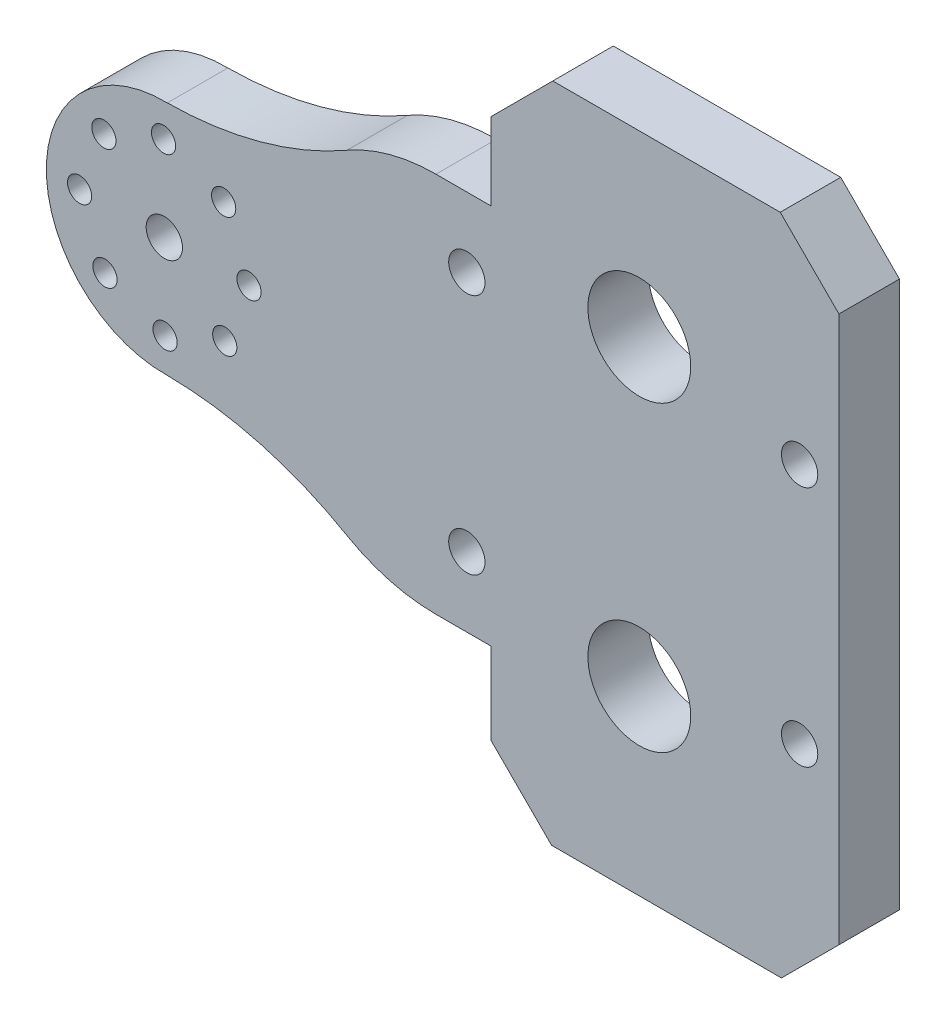
ISO-10303-21;
HEADER;
FILE_DESCRIPTION(('STEP AP214'),'2;1');
FILE_NAME('part.step','',(''),(''),'','','');
FILE_SCHEMA(('AUTOMOTIVE_DESIGN { 1 0 10303 214 1 1 1 1 }'));
ENDSEC;
DATA;
#1=APPLICATION_CONTEXT('core data for automotive mechanical design processes');
#2=APPLICATION_PROTOCOL_DEFINITION('international standard','automotive_design',2000,#1);
#3=PRODUCT_CONTEXT('',#1,'mechanical');
#4=PRODUCT('Part','Part','',(#3));
#5=PRODUCT_RELATED_PRODUCT_CATEGORY('part','',(#4));
#6=PRODUCT_DEFINITION_FORMATION('','',#4);
#7=PRODUCT_DEFINITION_CONTEXT('part definition',#1,'design');
#8=PRODUCT_DEFINITION('design','',#6,#7);
#9=PRODUCT_DEFINITION_SHAPE('','',#8);
#10=(LENGTH_UNIT() NAMED_UNIT(*) SI_UNIT(.MILLI.,.METRE.));
#11=(NAMED_UNIT(*) PLANE_ANGLE_UNIT() SI_UNIT($,.RADIAN.));
#12=(NAMED_UNIT(*) SI_UNIT($,.STERADIAN.) SOLID_ANGLE_UNIT());
#13=UNCERTAINTY_MEASURE_WITH_UNIT(LENGTH_MEASURE(1.E-05),#10,'distance_accuracy_value','');
#14=(GEOMETRIC_REPRESENTATION_CONTEXT(3) GLOBAL_UNCERTAINTY_ASSIGNED_CONTEXT((#13)) GLOBAL_UNIT_ASSIGNED_CONTEXT((#10,
#11,#12)) REPRESENTATION_CONTEXT('',''));
#15=CARTESIAN_POINT('',(0.,0.,0.));
#16=DIRECTION('',(0.,0.,1.));
#17=DIRECTION('',(1.,0.,0.));
#18=AXIS2_PLACEMENT_3D('',#15,#16,#17);
#19=CARTESIAN_POINT('',(16.700860260171,3.2922916539892,5.));
#20=DIRECTION('',(0.,0.,1.));
#21=DIRECTION('',(1.,0.,0.));
#22=AXIS2_PLACEMENT_3D('',#19,#20,#21);
#23=PLANE('',#22);
#24=CARTESIAN_POINT('',(-5.8115386358992,9.29229165398919,5.));
#25=DIRECTION('',(0.,0.,1.));
#26=DIRECTION('',(1.,0.,0.));
#27=AXIS2_PLACEMENT_3D('',#24,#25,#26);
#28=CIRCLE('',#27,1.);
#29=CARTESIAN_POINT('',(-4.8115386358992,9.29229165398919,5.));
#30=VERTEX_POINT('',#29);
#31=EDGE_CURVE('E417',#30,#30,#28,.T.);
#32=ORIENTED_EDGE('',*,*,#31,.F.);
#33=EDGE_LOOP('',(#32));
#34=FACE_BOUND('',#33,.T.);
#35=CARTESIAN_POINT('',(-12.7490840604726,2.22983707856261,5.));
#36=DIRECTION('',(0.,0.,1.));
#37=DIRECTION('',(1.,0.,0.));
#38=AXIS2_PLACEMENT_3D('',#35,#36,#37);
#39=CIRCLE('',#38,0.999999999999998);
#40=CARTESIAN_POINT('',(-11.7490840604726,2.22983707856261,5.));
#41=VERTEX_POINT('',#40);
#42=EDGE_CURVE('E429',#41,#41,#39,.T.);
#43=ORIENTED_EDGE('',*,*,#42,.F.);
#44=EDGE_LOOP('',(#43));
#45=FACE_BOUND('',#44,.T.);
#46=CARTESIAN_POINT('',(-5.68662948504604,-4.70770834601081,5.));
#47=DIRECTION('',(0.,0.,1.));
#48=DIRECTION('',(1.,0.,0.));
#49=AXIS2_PLACEMENT_3D('',#46,#47,#48);
#50=CIRCLE('',#49,1.);
#51=CARTESIAN_POINT('',(-4.68662948504604,-4.70770834601081,5.));
#52=VERTEX_POINT('',#51);
#53=EDGE_CURVE('E441',#52,#52,#50,.T.);
#54=ORIENTED_EDGE('',*,*,#53,.F.);
#55=EDGE_LOOP('',(#54));
#56=FACE_BOUND('',#55,.T.);
#57=CARTESIAN_POINT('',(1.25091593952738,2.35474622941577,5.));
#58=DIRECTION('',(0.,0.,1.));
#59=DIRECTION('',(1.,0.,0.));
#60=AXIS2_PLACEMENT_3D('',#57,#58,#59);
#61=CIRCLE('',#60,1.);
#62=CARTESIAN_POINT('',(2.25091593952738,2.35474622941577,5.));
#63=VERTEX_POINT('',#62);
#64=EDGE_CURVE('E453',#63,#63,#61,.T.);
#65=ORIENTED_EDGE('',*,*,#64,.F.);
#66=EDGE_LOOP('',(#65));
#67=FACE_BOUND('',#66,.T.);
#68=CARTESIAN_POINT('',(19.2509159395274,-7.70770834601081,5.));
#69=DIRECTION('',(0.,0.,1.));
#70=DIRECTION('',(1.,0.,0.));
#71=AXIS2_PLACEMENT_3D('',#68,#69,#70);
#72=CIRCLE('',#71,1.5);
#73=CARTESIAN_POINT('',(20.7509159395274,-7.70770834601081,5.));
#74=VERTEX_POINT('',#73);
#75=EDGE_CURVE('E465',#74,#74,#72,.T.);
#76=ORIENTED_EDGE('',*,*,#75,.F.);
#77=EDGE_LOOP('',(#76));
#78=FACE_BOUND('',#77,.T.);
#79=CARTESIAN_POINT('',(33.5009159395274,-10.2077083460108,5.));
#80=DIRECTION('',(0.,0.,1.));
#81=DIRECTION('',(1.,0.,0.));
#82=AXIS2_PLACEMENT_3D('',#79,#80,#81);
#83=CIRCLE('',#82,4.25000000000001);
#84=CARTESIAN_POINT('',(37.7509159395274,-10.2077083460108,5.));
#85=VERTEX_POINT('',#84);
#86=EDGE_CURVE('E477',#85,#85,#83,.T.);
#87=ORIENTED_EDGE('',*,*,#86,.F.);
#88=EDGE_LOOP('',(#87));
#89=FACE_BOUND('',#88,.T.);
#90=CARTESIAN_POINT('',(46.7509159395274,12.2922916539892,5.));
#91=DIRECTION('',(0.,0.,1.));
#92=DIRECTION('',(1.,0.,0.));
#93=AXIS2_PLACEMENT_3D('',#90,#91,#92);
#94=CIRCLE('',#93,1.5);
#95=CARTESIAN_POINT('',(48.2509159395274,12.2922916539892,5.));
#96=VERTEX_POINT('',#95);
#97=EDGE_CURVE('E489',#96,#96,#94,.T.);
#98=ORIENTED_EDGE('',*,*,#97,.F.);
#99=EDGE_LOOP('',(#98));
#100=FACE_BOUND('',#99,.T.);
#101=DIRECTION('',(1.,0.,0.));
#102=VECTOR('',#101,1.);
#103=CARTESIAN_POINT('',(26.2509159395273,-25.2077083460108,5.));
#104=LINE('',#103,#102);
#105=CARTESIAN_POINT('',(26.2509159395273,-25.2077083460108,5.));
#106=VERTEX_POINT('',#105);
#107=CARTESIAN_POINT('',(45.2509159395274,-25.2077083460108,5.));
#108=VERTEX_POINT('',#107);
#109=EDGE_CURVE('E228',#106,#108,#104,.T.);
#110=ORIENTED_EDGE('',*,*,#109,.T.);
#111=DIRECTION('',(0.707106781186549,0.707106781186546,0.));
#112=VECTOR('',#111,1.);
#113=CARTESIAN_POINT('',(45.2509159395274,-25.2077083460108,5.));
#114=LINE('',#113,#112);
#115=CARTESIAN_POINT('',(50.0009159395274,-20.4577083460108,5.));
#116=VERTEX_POINT('',#115);
#117=EDGE_CURVE('E125',#108,#116,#114,.T.);
#118=ORIENTED_EDGE('',*,*,#117,.T.);
#119=DIRECTION('',(0.,1.,0.));
#120=VECTOR('',#119,1.);
#121=CARTESIAN_POINT('',(50.0009159395274,-20.4577083460108,5.));
#122=LINE('',#121,#120);
#123=CARTESIAN_POINT('',(50.0009159395274,24.6887382633959,5.));
#124=VERTEX_POINT('',#123);
#125=EDGE_CURVE('E273',#116,#124,#122,.T.);
#126=ORIENTED_EDGE('',*,*,#125,.T.);
#127=DIRECTION('',(-0.707106781186548,0.707106781186547,0.));
#128=VECTOR('',#127,1.);
#129=CARTESIAN_POINT('',(50.0009159395274,24.6887382633959,5.));
#130=LINE('',#129,#128);
#131=CARTESIAN_POINT('',(45.1473625489341,29.5422916539892,5.));
#132=VERTEX_POINT('',#131);
#133=EDGE_CURVE('E292',#124,#132,#130,.T.);
#134=ORIENTED_EDGE('',*,*,#133,.T.);
#135=DIRECTION('',(-1.,0.,0.));
#136=VECTOR('',#135,1.);
#137=CARTESIAN_POINT('',(45.1473625489341,29.5422916539892,5.));
#138=LINE('',#137,#136);
#139=CARTESIAN_POINT('',(26.3544693301207,29.5422916539892,5.));
#140=VERTEX_POINT('',#139);
#141=EDGE_CURVE('E289',#132,#140,#138,.T.);
#142=ORIENTED_EDGE('',*,*,#141,.T.);
#143=DIRECTION('',(-0.707106781186548,-0.707106781186547,0.));
#144=VECTOR('',#143,1.);
#145=CARTESIAN_POINT('',(26.3544693301207,29.5422916539892,5.));
#146=LINE('',#145,#144);
#147=CARTESIAN_POINT('',(21.2509159395274,24.4387382633959,5.));
#148=VERTEX_POINT('',#147);
#149=EDGE_CURVE('E291',#140,#148,#146,.T.);
#150=ORIENTED_EDGE('',*,*,#149,.T.);
#151=DIRECTION('',(0.,-1.,0.));
#152=VECTOR('',#151,1.);
#153=CARTESIAN_POINT('',(21.2509159395274,24.4387382633959,5.));
#154=LINE('',#153,#152);
#155=CARTESIAN_POINT('',(21.2509159395274,18.0422916539892,5.));
#156=VERTEX_POINT('',#155);
#157=EDGE_CURVE('E294',#148,#156,#154,.T.);
#158=ORIENTED_EDGE('',*,*,#157,.T.);
#159=DIRECTION('',(-1.,0.,0.));
#160=VECTOR('',#159,1.);
#161=CARTESIAN_POINT('',(21.2509159395274,18.0422916539892,5.));
#162=LINE('',#161,#160);
#163=CARTESIAN_POINT('',(16.700860260171,18.0422916539892,5.));
#164=VERTEX_POINT('',#163);
#165=EDGE_CURVE('E300',#156,#164,#162,.T.);
#166=ORIENTED_EDGE('',*,*,#165,.T.);
#167=CARTESIAN_POINT('',(16.700860260171,3.2922916539892,5.));
#168=DIRECTION('',(0.,0.,1.));
#169=DIRECTION('',(1.,0.,0.));
#170=AXIS2_PLACEMENT_3D('',#167,#168,#169);
#171=CIRCLE('',#170,14.75);
#172=CARTESIAN_POINT('',(9.34226739951562,16.0756249873225,5.));
#173=VERTEX_POINT('',#172);
#174=EDGE_CURVE('E302',#164,#173,#171,.T.);
#175=ORIENTED_EDGE('',*,*,#174,.T.);
#176=CARTESIAN_POINT('',(-5.74908406047262,42.2922916539892,5.));
#177=DIRECTION('',(0.,0.,-1.));
#178=DIRECTION('',(1.,0.,0.));
#179=AXIS2_PLACEMENT_3D('',#176,#177,#178);
#180=CIRCLE('',#179,30.25);
#181=CARTESIAN_POINT('',(-5.49908406047263,12.0433247294808,5.));
#182=VERTEX_POINT('',#181);
#183=EDGE_CURVE('E304',#173,#182,#180,.T.);
#184=ORIENTED_EDGE('',*,*,#183,.T.);
#185=DIRECTION('',(3.06941559721248E-12,-1.,0.));
#186=VECTOR('',#185,1.);
#187=CARTESIAN_POINT('',(-5.49908406047263,12.0433247294808,5.));
#188=LINE('',#187,#186);
#189=CARTESIAN_POINT('',(-5.49908406047262,12.0390859987982,5.));
#190=VERTEX_POINT('',#189);
#191=EDGE_CURVE('E306',#182,#190,#188,.T.);
#192=ORIENTED_EDGE('',*,*,#191,.T.);
#193=CARTESIAN_POINT('',(-5.74908406047262,2.29229165398919,5.));
#194=DIRECTION('',(0.,0.,1.));
#195=DIRECTION('',(1.,0.,0.));
#196=AXIS2_PLACEMENT_3D('',#193,#194,#195);
#197=CIRCLE('',#196,9.75);
#198=CARTESIAN_POINT('',(-5.49908406047262,-7.45450269081977,5.));
#199=VERTEX_POINT('',#198);
#200=EDGE_CURVE('E308',#190,#199,#197,.T.);
#201=ORIENTED_EDGE('',*,*,#200,.T.);
#202=DIRECTION('',(4.09255412961497E-13,-1.,0.));
#203=VECTOR('',#202,1.);
#204=CARTESIAN_POINT('',(-5.49908406047262,-7.45450269081977,5.));
#205=LINE('',#204,#203);
#206=CARTESIAN_POINT('',(-5.49908406047262,-7.45874142150246,5.));
#207=VERTEX_POINT('',#206);
#208=EDGE_CURVE('E310',#199,#207,#205,.T.);
#209=ORIENTED_EDGE('',*,*,#208,.T.);
#210=CARTESIAN_POINT('',(-5.74908406047262,-37.7077083460108,5.));
#211=DIRECTION('',(0.,0.,-1.));
#212=DIRECTION('',(1.,0.,0.));
#213=AXIS2_PLACEMENT_3D('',#210,#211,#212);
#214=CIRCLE('',#213,30.25);
#215=CARTESIAN_POINT('',(9.3422673995156,-11.4910416793441,5.));
#216=VERTEX_POINT('',#215);
#217=EDGE_CURVE('E312',#207,#216,#214,.T.);
#218=ORIENTED_EDGE('',*,*,#217,.T.);
#219=CARTESIAN_POINT('',(16.700860260171,1.2922916539892,5.));
#220=DIRECTION('',(0.,0.,1.));
#221=DIRECTION('',(1.,0.,0.));
#222=AXIS2_PLACEMENT_3D('',#219,#220,#221);
#223=CIRCLE('',#222,14.75);
#224=CARTESIAN_POINT('',(16.700860260171,-13.4577083460108,5.));
#225=VERTEX_POINT('',#224);
#226=EDGE_CURVE('E174',#216,#225,#223,.T.);
#227=ORIENTED_EDGE('',*,*,#226,.T.);
#228=DIRECTION('',(1.,0.,0.));
#229=VECTOR('',#228,1.);
#230=CARTESIAN_POINT('',(16.700860260171,-13.4577083460108,5.));
#231=LINE('',#230,#229);
#232=CARTESIAN_POINT('',(21.2509159395274,-13.4577083460108,5.));
#233=VERTEX_POINT('',#232);
#234=EDGE_CURVE('E168',#225,#233,#231,.T.);
#235=ORIENTED_EDGE('',*,*,#234,.T.);
#236=DIRECTION('',(0.,-1.,0.));
#237=VECTOR('',#236,1.);
#238=CARTESIAN_POINT('',(21.2509159395274,-13.4577083460108,5.));
#239=LINE('',#238,#237);
#240=CARTESIAN_POINT('',(21.2509159395274,-20.2077083460108,5.));
#241=VERTEX_POINT('',#240);
#242=EDGE_CURVE('E172',#233,#241,#239,.T.);
#243=ORIENTED_EDGE('',*,*,#242,.T.);
#244=DIRECTION('',(0.707106781186544,-0.707106781186551,0.));
#245=VECTOR('',#244,1.);
#246=CARTESIAN_POINT('',(21.2509159395274,-20.2077083460108,5.));
#247=LINE('',#246,#245);
#248=EDGE_CURVE('E52',#241,#106,#247,.T.);
#249=ORIENTED_EDGE('',*,*,#248,.T.);
#250=EDGE_LOOP('',(#110,#118,#126,#134,#142,#150,#158,#166,#175,#184,#192,#201,#209,#218,#227,
#235,#243,#249));
#251=FACE_BOUND('',#250,.T.);
#252=CARTESIAN_POINT('',(46.7509159395274,-7.70770834601081,5.));
#253=DIRECTION('',(0.,0.,1.));
#254=DIRECTION('',(1.,0.,0.));
#255=AXIS2_PLACEMENT_3D('',#252,#253,#254);
#256=CIRCLE('',#255,1.5);
#257=CARTESIAN_POINT('',(48.2509159395274,-7.70770834601081,5.));
#258=VERTEX_POINT('',#257);
#259=EDGE_CURVE('E195',#258,#258,#256,.T.);
#260=ORIENTED_EDGE('',*,*,#259,.F.);
#261=EDGE_LOOP('',(#260));
#262=FACE_BOUND('',#261,.T.);
#263=CARTESIAN_POINT('',(33.5009159395274,14.7922916539892,5.));
#264=DIRECTION('',(0.,0.,1.));
#265=DIRECTION('',(1.,0.,0.));
#266=AXIS2_PLACEMENT_3D('',#263,#264,#265);
#267=CIRCLE('',#266,4.25);
#268=CARTESIAN_POINT('',(37.7509159395274,14.7922916539892,5.));
#269=VERTEX_POINT('',#268);
#270=EDGE_CURVE('E483',#269,#269,#267,.T.);
#271=ORIENTED_EDGE('',*,*,#270,.F.);
#272=EDGE_LOOP('',(#271));
#273=FACE_BOUND('',#272,.T.);
#274=CARTESIAN_POINT('',(19.2509159395274,12.2922916539892,5.));
#275=DIRECTION('',(0.,0.,1.));
#276=DIRECTION('',(1.,0.,0.));
#277=AXIS2_PLACEMENT_3D('',#274,#275,#276);
#278=CIRCLE('',#277,1.5);
#279=CARTESIAN_POINT('',(20.7509159395274,12.2922916539892,5.));
#280=VERTEX_POINT('',#279);
#281=EDGE_CURVE('E471',#280,#280,#278,.T.);
#282=ORIENTED_EDGE('',*,*,#281,.F.);
#283=EDGE_LOOP('',(#282));
#284=FACE_BOUND('',#283,.T.);
#285=CARTESIAN_POINT('',(-5.74908406047262,2.29229165398919,5.));
#286=DIRECTION('',(0.,0.,1.));
#287=DIRECTION('',(1.,0.,0.));
#288=AXIS2_PLACEMENT_3D('',#285,#286,#287);
#289=CIRCLE('',#288,1.50000000000001);
#290=CARTESIAN_POINT('',(-4.24908406047262,2.29229165398919,5.));
#291=VERTEX_POINT('',#290);
#292=EDGE_CURVE('E459',#291,#291,#289,.T.);
#293=ORIENTED_EDGE('',*,*,#292,.F.);
#294=EDGE_LOOP('',(#293));
#295=FACE_BOUND('',#294,.T.);
#296=CARTESIAN_POINT('',(-0.755373292965727,-2.61309852116362,5.));
#297=DIRECTION('',(0.,0.,1.));
#298=DIRECTION('',(1.,0.,0.));
#299=AXIS2_PLACEMENT_3D('',#296,#297,#298);
#300=CIRCLE('',#299,1.);
#301=CARTESIAN_POINT('',(0.244626707034274,-2.61309852116362,5.));
#302=VERTEX_POINT('',#301);
#303=EDGE_CURVE('E447',#302,#302,#300,.T.);
#304=ORIENTED_EDGE('',*,*,#303,.F.);
#305=EDGE_LOOP('',(#304));
#306=FACE_BOUND('',#305,.T.);
#307=CARTESIAN_POINT('',(-10.6544742356254,-2.7014191135177,5.));
#308=DIRECTION('',(0.,0.,1.));
#309=DIRECTION('',(1.,0.,0.));
#310=AXIS2_PLACEMENT_3D('',#307,#308,#309);
#311=CIRCLE('',#310,0.999999999999998);
#312=CARTESIAN_POINT('',(-9.65447423562543,-2.7014191135177,5.));
#313=VERTEX_POINT('',#312);
#314=EDGE_CURVE('E435',#313,#313,#311,.T.);
#315=ORIENTED_EDGE('',*,*,#314,.F.);
#316=EDGE_LOOP('',(#315));
#317=FACE_BOUND('',#316,.T.);
#318=CARTESIAN_POINT('',(-10.7427948279795,7.197681829142,5.));
#319=DIRECTION('',(0.,0.,1.));
#320=DIRECTION('',(1.,0.,0.));
#321=AXIS2_PLACEMENT_3D('',#318,#319,#320);
#322=CIRCLE('',#321,1.);
#323=CARTESIAN_POINT('',(-9.74279482797952,7.197681829142,5.));
#324=VERTEX_POINT('',#323);
#325=EDGE_CURVE('E423',#324,#324,#322,.T.);
#326=ORIENTED_EDGE('',*,*,#325,.F.);
#327=EDGE_LOOP('',(#326));
#328=FACE_BOUND('',#327,.T.);
#329=CARTESIAN_POINT('',(-0.843693885319811,7.28600242149609,5.));
#330=DIRECTION('',(0.,0.,1.));
#331=DIRECTION('',(1.,0.,0.));
#332=AXIS2_PLACEMENT_3D('',#329,#330,#331);
#333=CIRCLE('',#332,1.);
#334=CARTESIAN_POINT('',(0.156306114680189,7.28600242149609,5.));
#335=VERTEX_POINT('',#334);
#336=EDGE_CURVE('E408',#335,#335,#333,.T.);
#337=ORIENTED_EDGE('',*,*,#336,.F.);
#338=EDGE_LOOP('',(#337));
#339=FACE_BOUND('',#338,.T.);
#340=ADVANCED_FACE('F35',(#34,#45,#56,#67,#78,#89,#100,#251,#262,#273,#284,#295,#306,#317,#328,
#339),#23,.T.);
#341=CARTESIAN_POINT('',(16.700860260171,3.2922916539892,0.));
#342=DIRECTION('',(0.,0.,1.));
#343=DIRECTION('',(1.,0.,0.));
#344=AXIS2_PLACEMENT_3D('',#341,#342,#343);
#345=PLANE('',#344);
#346=DIRECTION('',(1.,0.,0.));
#347=VECTOR('',#346,1.);
#348=CARTESIAN_POINT('',(26.2509159395273,-25.2077083460108,0.));
#349=LINE('',#348,#347);
#350=CARTESIAN_POINT('',(26.2509159395273,-25.2077083460108,0.));
#351=VERTEX_POINT('',#350);
#352=CARTESIAN_POINT('',(45.2509159395274,-25.2077083460108,0.));
#353=VERTEX_POINT('',#352);
#354=EDGE_CURVE('E191',#351,#353,#349,.T.);
#355=ORIENTED_EDGE('',*,*,#354,.F.);
#356=DIRECTION('',(0.707106781186544,-0.707106781186551,0.));
#357=VECTOR('',#356,1.);
#358=CARTESIAN_POINT('',(21.2509159395274,-20.2077083460108,0.));
#359=LINE('',#358,#357);
#360=CARTESIAN_POINT('',(21.2509159395274,-20.2077083460108,0.));
#361=VERTEX_POINT('',#360);
#362=EDGE_CURVE('E117',#361,#351,#359,.T.);
#363=ORIENTED_EDGE('',*,*,#362,.F.);
#364=DIRECTION('',(0.,-1.,0.));
#365=VECTOR('',#364,1.);
#366=CARTESIAN_POINT('',(21.2509159395274,-13.4577083460108,0.));
#367=LINE('',#366,#365);
#368=CARTESIAN_POINT('',(21.2509159395274,-13.4577083460108,0.));
#369=VERTEX_POINT('',#368);
#370=EDGE_CURVE('E111',#369,#361,#367,.T.);
#371=ORIENTED_EDGE('',*,*,#370,.F.);
#372=DIRECTION('',(1.,0.,0.));
#373=VECTOR('',#372,1.);
#374=CARTESIAN_POINT('',(20.4080953628798,-13.4577083460108,0.));
#375=LINE('',#374,#373);
#376=CARTESIAN_POINT('',(16.700860260171,-13.4577083460108,0.));
#377=VERTEX_POINT('',#376);
#378=EDGE_CURVE('E181',#377,#369,#375,.T.);
#379=ORIENTED_EDGE('',*,*,#378,.F.);
#380=CARTESIAN_POINT('',(16.700860260171,1.2922916539892,0.));
#381=DIRECTION('',(0.,0.,1.));
#382=DIRECTION('',(1.,0.,0.));
#383=AXIS2_PLACEMENT_3D('',#380,#381,#382);
#384=CIRCLE('',#383,14.75);
#385=CARTESIAN_POINT('',(9.3422673995156,-11.4910416793441,0.));
#386=VERTEX_POINT('',#385);
#387=EDGE_CURVE('E222',#386,#377,#384,.T.);
#388=ORIENTED_EDGE('',*,*,#387,.F.);
#389=CARTESIAN_POINT('',(-5.74908406047262,-37.7077083460108,0.));
#390=DIRECTION('',(0.,0.,-1.));
#391=DIRECTION('',(1.,0.,0.));
#392=AXIS2_PLACEMENT_3D('',#389,#390,#391);
#393=CIRCLE('',#392,30.25);
#394=CARTESIAN_POINT('',(-5.49908406047262,-7.45874142150246,0.));
#395=VERTEX_POINT('',#394);
#396=EDGE_CURVE('E220',#395,#386,#393,.T.);
#397=ORIENTED_EDGE('',*,*,#396,.F.);
#398=DIRECTION('',(4.09255412961497E-13,-1.,0.));
#399=VECTOR('',#398,1.);
#400=CARTESIAN_POINT('',(-5.49908406047262,-7.45450269081977,0.));
#401=LINE('',#400,#399);
#402=CARTESIAN_POINT('',(-5.49908406047262,-7.45450269081977,0.));
#403=VERTEX_POINT('',#402);
#404=EDGE_CURVE('E218',#403,#395,#401,.T.);
#405=ORIENTED_EDGE('',*,*,#404,.F.);
#406=CARTESIAN_POINT('',(-5.74908406047262,2.29229165398919,0.));
#407=DIRECTION('',(0.,0.,1.));
#408=DIRECTION('',(1.,0.,0.));
#409=AXIS2_PLACEMENT_3D('',#406,#407,#408);
#410=CIRCLE('',#409,9.75);
#411=CARTESIAN_POINT('',(-5.49908406047262,12.0390859987982,0.));
#412=VERTEX_POINT('',#411);
#413=EDGE_CURVE('E216',#412,#403,#410,.T.);
#414=ORIENTED_EDGE('',*,*,#413,.F.);
#415=DIRECTION('',(3.06941559721248E-12,-1.,0.));
#416=VECTOR('',#415,1.);
#417=CARTESIAN_POINT('',(-5.49908406047263,12.0433247294808,0.));
#418=LINE('',#417,#416);
#419=CARTESIAN_POINT('',(-5.49908406047263,12.0433247294808,0.));
#420=VERTEX_POINT('',#419);
#421=EDGE_CURVE('E214',#420,#412,#418,.T.);
#422=ORIENTED_EDGE('',*,*,#421,.F.);
#423=CARTESIAN_POINT('',(-5.74908406047262,42.2922916539892,0.));
#424=DIRECTION('',(0.,0.,-1.));
#425=DIRECTION('',(1.,0.,0.));
#426=AXIS2_PLACEMENT_3D('',#423,#424,#425);
#427=CIRCLE('',#426,30.25);
#428=CARTESIAN_POINT('',(9.34226739951562,16.0756249873225,0.));
#429=VERTEX_POINT('',#428);
#430=EDGE_CURVE('E212',#429,#420,#427,.T.);
#431=ORIENTED_EDGE('',*,*,#430,.F.);
#432=CARTESIAN_POINT('',(16.700860260171,3.2922916539892,0.));
#433=DIRECTION('',(0.,0.,1.));
#434=DIRECTION('',(1.,0.,0.));
#435=AXIS2_PLACEMENT_3D('',#432,#433,#434);
#436=CIRCLE('',#435,14.75);
#437=CARTESIAN_POINT('',(16.700860260171,18.0422916539892,0.));
#438=VERTEX_POINT('',#437);
#439=EDGE_CURVE('E210',#438,#429,#436,.T.);
#440=ORIENTED_EDGE('',*,*,#439,.F.);
#441=DIRECTION('',(-1.,0.,0.));
#442=VECTOR('',#441,1.);
#443=CARTESIAN_POINT('',(20.4080953628798,18.0422916539892,0.));
#444=LINE('',#443,#442);
#445=CARTESIAN_POINT('',(21.2509159395274,18.0422916539892,0.));
#446=VERTEX_POINT('',#445);
#447=EDGE_CURVE('E208',#446,#438,#444,.T.);
#448=ORIENTED_EDGE('',*,*,#447,.F.);
#449=DIRECTION('',(0.,-1.,0.));
#450=VECTOR('',#449,1.);
#451=CARTESIAN_POINT('',(21.2509159395274,24.4387382633959,0.));
#452=LINE('',#451,#450);
#453=CARTESIAN_POINT('',(21.2509159395274,24.4387382633959,0.));
#454=VERTEX_POINT('',#453);
#455=EDGE_CURVE('E205',#454,#446,#452,.T.);
#456=ORIENTED_EDGE('',*,*,#455,.F.);
#457=DIRECTION('',(-0.707106781186548,-0.707106781186547,0.));
#458=VECTOR('',#457,1.);
#459=CARTESIAN_POINT('',(26.3544693301207,29.5422916539892,0.));
#460=LINE('',#459,#458);
#461=CARTESIAN_POINT('',(26.3544693301207,29.5422916539892,0.));
#462=VERTEX_POINT('',#461);
#463=EDGE_CURVE('E203',#462,#454,#460,.T.);
#464=ORIENTED_EDGE('',*,*,#463,.F.);
#465=DIRECTION('',(-1.,0.,0.));
#466=VECTOR('',#465,1.);
#467=CARTESIAN_POINT('',(45.1473625489341,29.5422916539892,0.));
#468=LINE('',#467,#466);
#469=CARTESIAN_POINT('',(45.1473625489341,29.5422916539892,0.));
#470=VERTEX_POINT('',#469);
#471=EDGE_CURVE('E201',#470,#462,#468,.T.);
#472=ORIENTED_EDGE('',*,*,#471,.F.);
#473=DIRECTION('',(-0.707106781186548,0.707106781186547,0.));
#474=VECTOR('',#473,1.);
#475=CARTESIAN_POINT('',(50.0009159395274,24.6887382633959,0.));
#476=LINE('',#475,#474);
#477=CARTESIAN_POINT('',(50.0009159395274,24.6887382633959,0.));
#478=VERTEX_POINT('',#477);
#479=EDGE_CURVE('E199',#478,#470,#476,.T.);
#480=ORIENTED_EDGE('',*,*,#479,.F.);
#481=DIRECTION('',(0.,1.,0.));
#482=VECTOR('',#481,1.);
#483=CARTESIAN_POINT('',(50.0009159395274,-20.4577083460108,0.));
#484=LINE('',#483,#482);
#485=CARTESIAN_POINT('',(50.0009159395274,-20.4577083460108,0.));
#486=VERTEX_POINT('',#485);
#487=EDGE_CURVE('E197',#486,#478,#484,.T.);
#488=ORIENTED_EDGE('',*,*,#487,.F.);
#489=DIRECTION('',(0.707106781186549,0.707106781186546,0.));
#490=VECTOR('',#489,1.);
#491=CARTESIAN_POINT('',(45.2509159395274,-25.2077083460108,0.));
#492=LINE('',#491,#490);
#493=EDGE_CURVE('E194',#353,#486,#492,.T.);
#494=ORIENTED_EDGE('',*,*,#493,.F.);
#495=EDGE_LOOP('',(#355,#363,#371,#379,#388,#397,#405,#414,#422,#431,#440,#448,#456,#464,#472,
#480,#488,#494));
#496=FACE_BOUND('',#495,.T.);
#497=CARTESIAN_POINT('',(46.7509159395274,-7.70770834601081,0.));
#498=DIRECTION('',(0.,0.,1.));
#499=DIRECTION('',(1.,0.,0.));
#500=AXIS2_PLACEMENT_3D('',#497,#498,#499);
#501=CIRCLE('',#500,1.5);
#502=CARTESIAN_POINT('',(48.2509159395274,-7.70770834601081,0.));
#503=VERTEX_POINT('',#502);
#504=EDGE_CURVE('E492',#503,#503,#501,.T.);
#505=ORIENTED_EDGE('',*,*,#504,.T.);
#506=EDGE_LOOP('',(#505));
#507=FACE_BOUND('',#506,.T.);
#508=CARTESIAN_POINT('',(46.7509159395274,12.2922916539892,0.));
#509=DIRECTION('',(0.,0.,1.));
#510=DIRECTION('',(1.,0.,0.));
#511=AXIS2_PLACEMENT_3D('',#508,#509,#510);
#512=CIRCLE('',#511,1.5);
#513=CARTESIAN_POINT('',(48.2509159395274,12.2922916539892,0.));
#514=VERTEX_POINT('',#513);
#515=EDGE_CURVE('E486',#514,#514,#512,.T.);
#516=ORIENTED_EDGE('',*,*,#515,.T.);
#517=EDGE_LOOP('',(#516));
#518=FACE_BOUND('',#517,.T.);
#519=CARTESIAN_POINT('',(33.5009159395274,14.7922916539892,0.));
#520=DIRECTION('',(0.,0.,1.));
#521=DIRECTION('',(1.,0.,0.));
#522=AXIS2_PLACEMENT_3D('',#519,#520,#521);
#523=CIRCLE('',#522,4.25);
#524=CARTESIAN_POINT('',(37.7509159395274,14.7922916539892,0.));
#525=VERTEX_POINT('',#524);
#526=EDGE_CURVE('E480',#525,#525,#523,.T.);
#527=ORIENTED_EDGE('',*,*,#526,.T.);
#528=EDGE_LOOP('',(#527));
#529=FACE_BOUND('',#528,.T.);
#530=CARTESIAN_POINT('',(33.5009159395274,-10.2077083460108,0.));
#531=DIRECTION('',(0.,0.,1.));
#532=DIRECTION('',(1.,0.,0.));
#533=AXIS2_PLACEMENT_3D('',#530,#531,#532);
#534=CIRCLE('',#533,4.25000000000001);
#535=CARTESIAN_POINT('',(37.7509159395274,-10.2077083460108,0.));
#536=VERTEX_POINT('',#535);
#537=EDGE_CURVE('E474',#536,#536,#534,.T.);
#538=ORIENTED_EDGE('',*,*,#537,.T.);
#539=EDGE_LOOP('',(#538));
#540=FACE_BOUND('',#539,.T.);
#541=CARTESIAN_POINT('',(19.2509159395274,12.2922916539892,0.));
#542=DIRECTION('',(0.,0.,1.));
#543=DIRECTION('',(1.,0.,0.));
#544=AXIS2_PLACEMENT_3D('',#541,#542,#543);
#545=CIRCLE('',#544,1.5);
#546=CARTESIAN_POINT('',(20.7509159395274,12.2922916539892,0.));
#547=VERTEX_POINT('',#546);
#548=EDGE_CURVE('E468',#547,#547,#545,.T.);
#549=ORIENTED_EDGE('',*,*,#548,.T.);
#550=EDGE_LOOP('',(#549));
#551=FACE_BOUND('',#550,.T.);
#552=CARTESIAN_POINT('',(19.2509159395274,-7.70770834601081,0.));
#553=DIRECTION('',(0.,0.,1.));
#554=DIRECTION('',(1.,0.,0.));
#555=AXIS2_PLACEMENT_3D('',#552,#553,#554);
#556=CIRCLE('',#555,1.5);
#557=CARTESIAN_POINT('',(20.7509159395274,-7.70770834601081,0.));
#558=VERTEX_POINT('',#557);
#559=EDGE_CURVE('E462',#558,#558,#556,.T.);
#560=ORIENTED_EDGE('',*,*,#559,.T.);
#561=EDGE_LOOP('',(#560));
#562=FACE_BOUND('',#561,.T.);
#563=CARTESIAN_POINT('',(-5.74908406047262,2.29229165398919,0.));
#564=DIRECTION('',(0.,0.,1.));
#565=DIRECTION('',(1.,0.,0.));
#566=AXIS2_PLACEMENT_3D('',#563,#564,#565);
#567=CIRCLE('',#566,1.50000000000001);
#568=CARTESIAN_POINT('',(-4.24908406047262,2.29229165398919,0.));
#569=VERTEX_POINT('',#568);
#570=EDGE_CURVE('E456',#569,#569,#567,.T.);
#571=ORIENTED_EDGE('',*,*,#570,.T.);
#572=EDGE_LOOP('',(#571));
#573=FACE_BOUND('',#572,.T.);
#574=CARTESIAN_POINT('',(1.25091593952738,2.35474622941577,0.));
#575=DIRECTION('',(0.,0.,1.));
#576=DIRECTION('',(1.,0.,0.));
#577=AXIS2_PLACEMENT_3D('',#574,#575,#576);
#578=CIRCLE('',#577,1.);
#579=CARTESIAN_POINT('',(2.25091593952738,2.35474622941577,0.));
#580=VERTEX_POINT('',#579);
#581=EDGE_CURVE('E450',#580,#580,#578,.T.);
#582=ORIENTED_EDGE('',*,*,#581,.T.);
#583=EDGE_LOOP('',(#582));
#584=FACE_BOUND('',#583,.T.);
#585=CARTESIAN_POINT('',(-0.755373292965727,-2.61309852116362,0.));
#586=DIRECTION('',(0.,0.,1.));
#587=DIRECTION('',(1.,0.,0.));
#588=AXIS2_PLACEMENT_3D('',#585,#586,#587);
#589=CIRCLE('',#588,1.);
#590=CARTESIAN_POINT('',(0.244626707034274,-2.61309852116362,0.));
#591=VERTEX_POINT('',#590);
#592=EDGE_CURVE('E444',#591,#591,#589,.T.);
#593=ORIENTED_EDGE('',*,*,#592,.T.);
#594=EDGE_LOOP('',(#593));
#595=FACE_BOUND('',#594,.T.);
#596=CARTESIAN_POINT('',(-5.68662948504604,-4.70770834601081,0.));
#597=DIRECTION('',(0.,0.,1.));
#598=DIRECTION('',(1.,0.,0.));
#599=AXIS2_PLACEMENT_3D('',#596,#597,#598);
#600=CIRCLE('',#599,1.);
#601=CARTESIAN_POINT('',(-4.68662948504604,-4.70770834601081,0.));
#602=VERTEX_POINT('',#601);
#603=EDGE_CURVE('E438',#602,#602,#600,.T.);
#604=ORIENTED_EDGE('',*,*,#603,.T.);
#605=EDGE_LOOP('',(#604));
#606=FACE_BOUND('',#605,.T.);
#607=CARTESIAN_POINT('',(-10.6544742356254,-2.7014191135177,0.));
#608=DIRECTION('',(0.,0.,1.));
#609=DIRECTION('',(1.,0.,0.));
#610=AXIS2_PLACEMENT_3D('',#607,#608,#609);
#611=CIRCLE('',#610,0.999999999999998);
#612=CARTESIAN_POINT('',(-9.65447423562543,-2.7014191135177,0.));
#613=VERTEX_POINT('',#612);
#614=EDGE_CURVE('E432',#613,#613,#611,.T.);
#615=ORIENTED_EDGE('',*,*,#614,.T.);
#616=EDGE_LOOP('',(#615));
#617=FACE_BOUND('',#616,.T.);
#618=CARTESIAN_POINT('',(-12.7490840604726,2.22983707856261,0.));
#619=DIRECTION('',(0.,0.,1.));
#620=DIRECTION('',(1.,0.,0.));
#621=AXIS2_PLACEMENT_3D('',#618,#619,#620);
#622=CIRCLE('',#621,0.999999999999998);
#623=CARTESIAN_POINT('',(-11.7490840604726,2.22983707856261,0.));
#624=VERTEX_POINT('',#623);
#625=EDGE_CURVE('E426',#624,#624,#622,.T.);
#626=ORIENTED_EDGE('',*,*,#625,.T.);
#627=EDGE_LOOP('',(#626));
#628=FACE_BOUND('',#627,.T.);
#629=CARTESIAN_POINT('',(-10.7427948279795,7.197681829142,0.));
#630=DIRECTION('',(0.,0.,1.));
#631=DIRECTION('',(1.,0.,0.));
#632=AXIS2_PLACEMENT_3D('',#629,#630,#631);
#633=CIRCLE('',#632,1.);
#634=CARTESIAN_POINT('',(-9.74279482797952,7.197681829142,0.));
#635=VERTEX_POINT('',#634);
#636=EDGE_CURVE('E420',#635,#635,#633,.T.);
#637=ORIENTED_EDGE('',*,*,#636,.T.);
#638=EDGE_LOOP('',(#637));
#639=FACE_BOUND('',#638,.T.);
#640=CARTESIAN_POINT('',(-5.8115386358992,9.29229165398919,0.));
#641=DIRECTION('',(0.,0.,1.));
#642=DIRECTION('',(1.,0.,0.));
#643=AXIS2_PLACEMENT_3D('',#640,#641,#642);
#644=CIRCLE('',#643,1.);
#645=CARTESIAN_POINT('',(-4.8115386358992,9.29229165398919,0.));
#646=VERTEX_POINT('',#645);
#647=EDGE_CURVE('E414',#646,#646,#644,.T.);
#648=ORIENTED_EDGE('',*,*,#647,.T.);
#649=EDGE_LOOP('',(#648));
#650=FACE_BOUND('',#649,.T.);
#651=CARTESIAN_POINT('',(-0.843693885319811,7.28600242149609,0.));
#652=DIRECTION('',(0.,0.,1.));
#653=DIRECTION('',(1.,0.,0.));
#654=AXIS2_PLACEMENT_3D('',#651,#652,#653);
#655=CIRCLE('',#654,1.);
#656=CARTESIAN_POINT('',(0.156306114680189,7.28600242149609,0.));
#657=VERTEX_POINT('',#656);
#658=EDGE_CURVE('E411',#657,#657,#655,.T.);
#659=ORIENTED_EDGE('',*,*,#658,.T.);
#660=EDGE_LOOP('',(#659));
#661=FACE_BOUND('',#660,.T.);
#662=ADVANCED_FACE('F277',(#496,#507,#518,#529,#540,#551,#562,#573,#584,#595,#606,#617,#628,
#639,#650,#661),#345,.F.);
#663=CARTESIAN_POINT('',(26.2509159395273,-25.2077083460108,5.));
#664=DIRECTION('',(0.,1.,0.));
#665=DIRECTION('',(0.,0.,1.));
#666=AXIS2_PLACEMENT_3D('',#663,#664,#665);
#667=PLANE('',#666);
#668=ORIENTED_EDGE('',*,*,#354,.T.);
#669=DIRECTION('',(0.,0.,-1.));
#670=VECTOR('',#669,1.);
#671=CARTESIAN_POINT('',(45.2509159395274,-25.2077083460108,5.));
#672=LINE('',#671,#670);
#673=EDGE_CURVE('E11',#108,#353,#672,.T.);
#674=ORIENTED_EDGE('',*,*,#673,.F.);
#675=ORIENTED_EDGE('',*,*,#109,.F.);
#676=DIRECTION('',(0.,0.,-1.));
#677=VECTOR('',#676,1.);
#678=CARTESIAN_POINT('',(26.2509159395273,-25.2077083460108,5.));
#679=LINE('',#678,#677);
#680=EDGE_CURVE('E187',#106,#351,#679,.T.);
#681=ORIENTED_EDGE('',*,*,#680,.T.);
#682=EDGE_LOOP('',(#668,#674,#675,#681));
#683=FACE_BOUND('',#682,.T.);
#684=ADVANCED_FACE('F37',(#683),#667,.F.);
#685=CARTESIAN_POINT('',(45.2509159395274,-25.2077083460108,5.));
#686=DIRECTION('',(-0.707106781186546,0.707106781186549,0.));
#687=DIRECTION('',(-0.707106781186549,-0.707106781186546,0.));
#688=AXIS2_PLACEMENT_3D('',#685,#686,#687);
#689=PLANE('',#688);
#690=ORIENTED_EDGE('',*,*,#493,.T.);
#691=DIRECTION('',(0.,0.,-1.));
#692=VECTOR('',#691,1.);
#693=CARTESIAN_POINT('',(50.0009159395274,-20.4577083460108,5.));
#694=LINE('',#693,#692);
#695=EDGE_CURVE('E44',#116,#486,#694,.T.);
#696=ORIENTED_EDGE('',*,*,#695,.F.);
#697=ORIENTED_EDGE('',*,*,#117,.F.);
#698=ORIENTED_EDGE('',*,*,#673,.T.);
#699=EDGE_LOOP('',(#690,#696,#697,#698));
#700=FACE_BOUND('',#699,.T.);
#701=ADVANCED_FACE('F763',(#700),#689,.F.);
#702=CARTESIAN_POINT('',(50.0009159395274,-20.4577083460108,5.));
#703=DIRECTION('',(-1.,0.,0.));
#704=DIRECTION('',(0.,-1.,0.));
#705=AXIS2_PLACEMENT_3D('',#702,#703,#704);
#706=PLANE('',#705);
#707=ORIENTED_EDGE('',*,*,#487,.T.);
#708=DIRECTION('',(0.,0.,-1.));
#709=VECTOR('',#708,1.);
#710=CARTESIAN_POINT('',(50.0009159395274,24.6887382633959,5.));
#711=LINE('',#710,#709);
#712=EDGE_CURVE('E265',#124,#478,#711,.T.);
#713=ORIENTED_EDGE('',*,*,#712,.F.);
#714=ORIENTED_EDGE('',*,*,#125,.F.);
#715=ORIENTED_EDGE('',*,*,#695,.T.);
#716=EDGE_LOOP('',(#707,#713,#714,#715));
#717=FACE_BOUND('',#716,.T.);
#718=ADVANCED_FACE('F271',(#717),#706,.F.);
#719=CARTESIAN_POINT('',(50.0009159395274,24.6887382633959,5.));
#720=DIRECTION('',(-0.707106781186547,-0.707106781186548,0.));
#721=DIRECTION('',(0.707106781186548,-0.707106781186547,0.));
#722=AXIS2_PLACEMENT_3D('',#719,#720,#721);
#723=PLANE('',#722);
#724=ORIENTED_EDGE('',*,*,#479,.T.);
#725=DIRECTION('',(0.,0.,-1.));
#726=VECTOR('',#725,1.);
#727=CARTESIAN_POINT('',(45.1473625489341,29.5422916539892,5.));
#728=LINE('',#727,#726);
#729=EDGE_CURVE('E262',#132,#470,#728,.T.);
#730=ORIENTED_EDGE('',*,*,#729,.F.);
#731=ORIENTED_EDGE('',*,*,#133,.F.);
#732=ORIENTED_EDGE('',*,*,#712,.T.);
#733=EDGE_LOOP('',(#724,#730,#731,#732));
#734=FACE_BOUND('',#733,.T.);
#735=ADVANCED_FACE('F283',(#734),#723,.F.);
#736=CARTESIAN_POINT('',(45.1473625489341,29.5422916539892,5.));
#737=DIRECTION('',(0.,-1.,0.));
#738=DIRECTION('',(1.,0.,0.));
#739=AXIS2_PLACEMENT_3D('',#736,#737,#738);
#740=PLANE('',#739);
#741=ORIENTED_EDGE('',*,*,#471,.T.);
#742=DIRECTION('',(0.,0.,-1.));
#743=VECTOR('',#742,1.);
#744=CARTESIAN_POINT('',(26.3544693301207,29.5422916539892,5.));
#745=LINE('',#744,#743);
#746=EDGE_CURVE('E259',#140,#462,#745,.T.);
#747=ORIENTED_EDGE('',*,*,#746,.F.);
#748=ORIENTED_EDGE('',*,*,#141,.F.);
#749=ORIENTED_EDGE('',*,*,#729,.T.);
#750=EDGE_LOOP('',(#741,#747,#748,#749));
#751=FACE_BOUND('',#750,.T.);
#752=ADVANCED_FACE('F287',(#751),#740,.F.);
#753=CARTESIAN_POINT('',(26.3544693301207,29.5422916539892,5.));
#754=DIRECTION('',(0.707106781186547,-0.707106781186548,0.));
#755=DIRECTION('',(0.707106781186548,0.707106781186547,0.));
#756=AXIS2_PLACEMENT_3D('',#753,#754,#755);
#757=PLANE('',#756);
#758=ORIENTED_EDGE('',*,*,#463,.T.);
#759=DIRECTION('',(0.,0.,-1.));
#760=VECTOR('',#759,1.);
#761=CARTESIAN_POINT('',(21.2509159395274,24.4387382633959,5.));
#762=LINE('',#761,#760);
#763=EDGE_CURVE('E256',#148,#454,#762,.T.);
#764=ORIENTED_EDGE('',*,*,#763,.F.);
#765=ORIENTED_EDGE('',*,*,#149,.F.);
#766=ORIENTED_EDGE('',*,*,#746,.T.);
#767=EDGE_LOOP('',(#758,#764,#765,#766));
#768=FACE_BOUND('',#767,.T.);
#769=ADVANCED_FACE('F728',(#768),#757,.F.);
#770=CARTESIAN_POINT('',(21.2509159395274,24.4387382633959,5.));
#771=DIRECTION('',(1.,0.,0.));
#772=DIRECTION('',(0.,0.,-1.));
#773=AXIS2_PLACEMENT_3D('',#770,#771,#772);
#774=PLANE('',#773);
#775=ORIENTED_EDGE('',*,*,#455,.T.);
#776=DIRECTION('',(0.,0.,-1.));
#777=VECTOR('',#776,1.);
#778=CARTESIAN_POINT('',(21.2509159395274,18.0422916539892,5.));
#779=LINE('',#778,#777);
#780=EDGE_CURVE('E253',#156,#446,#779,.T.);
#781=ORIENTED_EDGE('',*,*,#780,.F.);
#782=ORIENTED_EDGE('',*,*,#157,.F.);
#783=ORIENTED_EDGE('',*,*,#763,.T.);
#784=EDGE_LOOP('',(#775,#781,#782,#783));
#785=FACE_BOUND('',#784,.T.);
#786=ADVANCED_FACE('F717',(#785),#774,.F.);
#787=CARTESIAN_POINT('',(20.4080953628798,18.0422916539892,5.));
#788=DIRECTION('',(0.,-1.,0.));
#789=DIRECTION('',(0.,0.,-1.));
#790=AXIS2_PLACEMENT_3D('',#787,#788,#789);
#791=PLANE('',#790);
#792=ORIENTED_EDGE('',*,*,#447,.T.);
#793=DIRECTION('',(0.,0.,-1.));
#794=VECTOR('',#793,1.);
#795=CARTESIAN_POINT('',(16.700860260171,18.0422916539892,5.));
#796=LINE('',#795,#794);
#797=EDGE_CURVE('E250',#164,#438,#796,.T.);
#798=ORIENTED_EDGE('',*,*,#797,.F.);
#799=ORIENTED_EDGE('',*,*,#165,.F.);
#800=ORIENTED_EDGE('',*,*,#780,.T.);
#801=EDGE_LOOP('',(#792,#798,#799,#800));
#802=FACE_BOUND('',#801,.T.);
#803=ADVANCED_FACE('F707',(#802),#791,.F.);
#804=CARTESIAN_POINT('',(16.700860260171,3.2922916539892,5.));
#805=DIRECTION('',(0.,0.,-1.));
#806=DIRECTION('',(-1.,0.,0.));
#807=AXIS2_PLACEMENT_3D('',#804,#805,#806);
#808=CYLINDRICAL_SURFACE('',#807,14.75);
#809=ORIENTED_EDGE('',*,*,#439,.T.);
#810=DIRECTION('',(0.,0.,-1.));
#811=VECTOR('',#810,1.);
#812=CARTESIAN_POINT('',(9.34226739951562,16.0756249873225,5.));
#813=LINE('',#812,#811);
#814=EDGE_CURVE('E247',#173,#429,#813,.T.);
#815=ORIENTED_EDGE('',*,*,#814,.F.);
#816=ORIENTED_EDGE('',*,*,#174,.F.);
#817=ORIENTED_EDGE('',*,*,#797,.T.);
#818=EDGE_LOOP('',(#809,#815,#816,#817));
#819=FACE_BOUND('',#818,.T.);
#820=ADVANCED_FACE('F697',(#819),#808,.T.);
#821=CARTESIAN_POINT('',(-5.74908406047262,42.2922916539892,5.));
#822=DIRECTION('',(0.,0.,-1.));
#823=DIRECTION('',(-1.,0.,0.));
#824=AXIS2_PLACEMENT_3D('',#821,#822,#823);
#825=CYLINDRICAL_SURFACE('',#824,30.25);
#826=ORIENTED_EDGE('',*,*,#430,.T.);
#827=DIRECTION('',(0.,0.,-1.));
#828=VECTOR('',#827,1.);
#829=CARTESIAN_POINT('',(-5.49908406047263,12.0433247294808,5.));
#830=LINE('',#829,#828);
#831=EDGE_CURVE('E244',#182,#420,#830,.T.);
#832=ORIENTED_EDGE('',*,*,#831,.F.);
#833=ORIENTED_EDGE('',*,*,#183,.F.);
#834=ORIENTED_EDGE('',*,*,#814,.T.);
#835=EDGE_LOOP('',(#826,#832,#833,#834));
#836=FACE_BOUND('',#835,.T.);
#837=ADVANCED_FACE('F687',(#836),#825,.F.);
#838=CARTESIAN_POINT('',(-5.49908406047263,12.0433247294808,5.));
#839=DIRECTION('',(1.,3.06941559721249E-12,0.));
#840=DIRECTION('',(-3.06941559721249E-12,1.,0.));
#841=AXIS2_PLACEMENT_3D('',#838,#839,#840);
#842=PLANE('',#841);
#843=ORIENTED_EDGE('',*,*,#421,.T.);
#844=DIRECTION('',(0.,0.,-1.));
#845=VECTOR('',#844,1.);
#846=CARTESIAN_POINT('',(-5.49908406047262,12.0390859987982,5.));
#847=LINE('',#846,#845);
#848=EDGE_CURVE('E241',#190,#412,#847,.T.);
#849=ORIENTED_EDGE('',*,*,#848,.F.);
#850=ORIENTED_EDGE('',*,*,#191,.F.);
#851=ORIENTED_EDGE('',*,*,#831,.T.);
#852=EDGE_LOOP('',(#843,#849,#850,#851));
#853=FACE_BOUND('',#852,.T.);
#854=ADVANCED_FACE('F677',(#853),#842,.F.);
#855=CARTESIAN_POINT('',(-5.74908406047262,2.29229165398919,5.));
#856=DIRECTION('',(0.,0.,-1.));
#857=DIRECTION('',(-1.,0.,0.));
#858=AXIS2_PLACEMENT_3D('',#855,#856,#857);
#859=CYLINDRICAL_SURFACE('',#858,9.75);
#860=ORIENTED_EDGE('',*,*,#413,.T.);
#861=DIRECTION('',(0.,0.,-1.));
#862=VECTOR('',#861,1.);
#863=CARTESIAN_POINT('',(-5.49908406047262,-7.45450269081977,5.));
#864=LINE('',#863,#862);
#865=EDGE_CURVE('E238',#199,#403,#864,.T.);
#866=ORIENTED_EDGE('',*,*,#865,.F.);
#867=ORIENTED_EDGE('',*,*,#200,.F.);
#868=ORIENTED_EDGE('',*,*,#848,.T.);
#869=EDGE_LOOP('',(#860,#866,#867,#868));
#870=FACE_BOUND('',#869,.T.);
#871=ADVANCED_FACE('F667',(#870),#859,.T.);
#872=CARTESIAN_POINT('',(-5.49908406047262,-7.45450269081977,5.));
#873=DIRECTION('',(1.,4.09255412961497E-13,0.));
#874=DIRECTION('',(-4.09255412961497E-13,1.,0.));
#875=AXIS2_PLACEMENT_3D('',#872,#873,#874);
#876=PLANE('',#875);
#877=ORIENTED_EDGE('',*,*,#404,.T.);
#878=DIRECTION('',(0.,0.,-1.));
#879=VECTOR('',#878,1.);
#880=CARTESIAN_POINT('',(-5.49908406047262,-7.45874142150246,5.));
#881=LINE('',#880,#879);
#882=EDGE_CURVE('E235',#207,#395,#881,.T.);
#883=ORIENTED_EDGE('',*,*,#882,.F.);
#884=ORIENTED_EDGE('',*,*,#208,.F.);
#885=ORIENTED_EDGE('',*,*,#865,.T.);
#886=EDGE_LOOP('',(#877,#883,#884,#885));
#887=FACE_BOUND('',#886,.T.);
#888=ADVANCED_FACE('F658',(#887),#876,.F.);
#889=CARTESIAN_POINT('',(-5.74908406047262,-37.7077083460108,5.));
#890=DIRECTION('',(0.,0.,-1.));
#891=DIRECTION('',(-1.,0.,0.));
#892=AXIS2_PLACEMENT_3D('',#889,#890,#891);
#893=CYLINDRICAL_SURFACE('',#892,30.25);
#894=ORIENTED_EDGE('',*,*,#396,.T.);
#895=DIRECTION('',(0.,0.,-1.));
#896=VECTOR('',#895,1.);
#897=CARTESIAN_POINT('',(9.3422673995156,-11.4910416793441,5.));
#898=LINE('',#897,#896);
#899=EDGE_CURVE('E232',#216,#386,#898,.T.);
#900=ORIENTED_EDGE('',*,*,#899,.F.);
#901=ORIENTED_EDGE('',*,*,#217,.F.);
#902=ORIENTED_EDGE('',*,*,#882,.T.);
#903=EDGE_LOOP('',(#894,#900,#901,#902));
#904=FACE_BOUND('',#903,.T.);
#905=ADVANCED_FACE('F318',(#904),#893,.F.);
#906=CARTESIAN_POINT('',(16.700860260171,1.2922916539892,5.));
#907=DIRECTION('',(0.,0.,-1.));
#908=DIRECTION('',(-1.,0.,0.));
#909=AXIS2_PLACEMENT_3D('',#906,#907,#908);
#910=CYLINDRICAL_SURFACE('',#909,14.75);
#911=ORIENTED_EDGE('',*,*,#387,.T.);
#912=DIRECTION('',(0.,0.,-1.));
#913=VECTOR('',#912,1.);
#914=CARTESIAN_POINT('',(16.700860260171,-13.4577083460108,5.));
#915=LINE('',#914,#913);
#916=EDGE_CURVE('E182',#225,#377,#915,.T.);
#917=ORIENTED_EDGE('',*,*,#916,.F.);
#918=ORIENTED_EDGE('',*,*,#226,.F.);
#919=ORIENTED_EDGE('',*,*,#899,.T.);
#920=EDGE_LOOP('',(#911,#917,#918,#919));
#921=FACE_BOUND('',#920,.T.);
#922=ADVANCED_FACE('F322',(#921),#910,.T.);
#923=CARTESIAN_POINT('',(20.4080953628798,-13.4577083460108,5.));
#924=DIRECTION('',(0.,1.,0.));
#925=DIRECTION('',(-1.,0.,0.));
#926=AXIS2_PLACEMENT_3D('',#923,#924,#925);
#927=PLANE('',#926);
#928=ORIENTED_EDGE('',*,*,#378,.T.);
#929=DIRECTION('',(0.,0.,-1.));
#930=VECTOR('',#929,1.);
#931=CARTESIAN_POINT('',(21.2509159395274,-13.4577083460108,5.));
#932=LINE('',#931,#930);
#933=EDGE_CURVE('E179',#233,#369,#932,.T.);
#934=ORIENTED_EDGE('',*,*,#933,.F.);
#935=ORIENTED_EDGE('',*,*,#234,.F.);
#936=ORIENTED_EDGE('',*,*,#916,.T.);
#937=EDGE_LOOP('',(#928,#934,#935,#936));
#938=FACE_BOUND('',#937,.T.);
#939=ADVANCED_FACE('F180',(#938),#927,.F.);
#940=CARTESIAN_POINT('',(21.2509159395274,-13.4577083460108,5.));
#941=DIRECTION('',(1.,0.,0.));
#942=DIRECTION('',(0.,0.,-1.));
#943=AXIS2_PLACEMENT_3D('',#940,#941,#942);
#944=PLANE('',#943);
#945=ORIENTED_EDGE('',*,*,#370,.T.);
#946=DIRECTION('',(0.,0.,-1.));
#947=VECTOR('',#946,1.);
#948=CARTESIAN_POINT('',(21.2509159395274,-20.2077083460108,5.));
#949=LINE('',#948,#947);
#950=EDGE_CURVE('E183',#241,#361,#949,.T.);
#951=ORIENTED_EDGE('',*,*,#950,.F.);
#952=ORIENTED_EDGE('',*,*,#242,.F.);
#953=ORIENTED_EDGE('',*,*,#933,.T.);
#954=EDGE_LOOP('',(#945,#951,#952,#953));
#955=FACE_BOUND('',#954,.T.);
#956=ADVANCED_FACE('F185',(#955),#944,.F.);
#957=CARTESIAN_POINT('',(21.2509159395274,-20.2077083460108,5.));
#958=DIRECTION('',(0.707106781186551,0.707106781186544,0.));
#959=DIRECTION('',(-0.707106781186544,0.707106781186551,0.));
#960=AXIS2_PLACEMENT_3D('',#957,#958,#959);
#961=PLANE('',#960);
#962=ORIENTED_EDGE('',*,*,#362,.T.);
#963=ORIENTED_EDGE('',*,*,#680,.F.);
#964=ORIENTED_EDGE('',*,*,#248,.F.);
#965=ORIENTED_EDGE('',*,*,#950,.T.);
#966=EDGE_LOOP('',(#962,#963,#964,#965));
#967=FACE_BOUND('',#966,.T.);
#968=ADVANCED_FACE('F327',(#967),#961,.F.);
#969=CARTESIAN_POINT('',(46.7509159395274,-7.70770834601081,5.));
#970=DIRECTION('',(0.,0.,-1.));
#971=DIRECTION('',(-1.,0.,0.));
#972=AXIS2_PLACEMENT_3D('',#969,#970,#971);
#973=CYLINDRICAL_SURFACE('',#972,1.5);
#974=ORIENTED_EDGE('',*,*,#259,.T.);
#975=EDGE_LOOP('',(#974));
#976=FACE_BOUND('',#975,.T.);
#977=ORIENTED_EDGE('',*,*,#504,.F.);
#978=EDGE_LOOP('',(#977));
#979=FACE_BOUND('',#978,.T.);
#980=ADVANCED_FACE('F329',(#976,#979),#973,.F.);
#981=CARTESIAN_POINT('',(46.7509159395274,12.2922916539892,5.));
#982=DIRECTION('',(0.,0.,-1.));
#983=DIRECTION('',(-1.,0.,0.));
#984=AXIS2_PLACEMENT_3D('',#981,#982,#983);
#985=CYLINDRICAL_SURFACE('',#984,1.5);
#986=ORIENTED_EDGE('',*,*,#97,.T.);
#987=EDGE_LOOP('',(#986));
#988=FACE_BOUND('',#987,.T.);
#989=ORIENTED_EDGE('',*,*,#515,.F.);
#990=EDGE_LOOP('',(#989));
#991=FACE_BOUND('',#990,.T.);
#992=ADVANCED_FACE('F335',(#988,#991),#985,.F.);
#993=CARTESIAN_POINT('',(33.5009159395274,14.7922916539892,5.));
#994=DIRECTION('',(0.,0.,-1.));
#995=DIRECTION('',(-1.,0.,0.));
#996=AXIS2_PLACEMENT_3D('',#993,#994,#995);
#997=CYLINDRICAL_SURFACE('',#996,4.25);
#998=ORIENTED_EDGE('',*,*,#270,.T.);
#999=EDGE_LOOP('',(#998));
#1000=FACE_BOUND('',#999,.T.);
#1001=ORIENTED_EDGE('',*,*,#526,.F.);
#1002=EDGE_LOOP('',(#1001));
#1003=FACE_BOUND('',#1002,.T.);
#1004=ADVANCED_FACE('F351',(#1000,#1003),#997,.F.);
#1005=CARTESIAN_POINT('',(33.5009159395274,-10.2077083460108,5.));
#1006=DIRECTION('',(0.,0.,-1.));
#1007=DIRECTION('',(-1.,0.,0.));
#1008=AXIS2_PLACEMENT_3D('',#1005,#1006,#1007);
#1009=CYLINDRICAL_SURFACE('',#1008,4.25000000000001);
#1010=ORIENTED_EDGE('',*,*,#86,.T.);
#1011=EDGE_LOOP('',(#1010));
#1012=FACE_BOUND('',#1011,.T.);
#1013=ORIENTED_EDGE('',*,*,#537,.F.);
#1014=EDGE_LOOP('',(#1013));
#1015=FACE_BOUND('',#1014,.T.);
#1016=ADVANCED_FACE('F355',(#1012,#1015),#1009,.F.);
#1017=CARTESIAN_POINT('',(19.2509159395274,12.2922916539892,5.));
#1018=DIRECTION('',(0.,0.,-1.));
#1019=DIRECTION('',(-1.,0.,0.));
#1020=AXIS2_PLACEMENT_3D('',#1017,#1018,#1019);
#1021=CYLINDRICAL_SURFACE('',#1020,1.5);
#1022=ORIENTED_EDGE('',*,*,#281,.T.);
#1023=EDGE_LOOP('',(#1022));
#1024=FACE_BOUND('',#1023,.T.);
#1025=ORIENTED_EDGE('',*,*,#548,.F.);
#1026=EDGE_LOOP('',(#1025));
#1027=FACE_BOUND('',#1026,.T.);
#1028=ADVANCED_FACE('F359',(#1024,#1027),#1021,.F.);
#1029=CARTESIAN_POINT('',(19.2509159395274,-7.70770834601081,5.));
#1030=DIRECTION('',(0.,0.,-1.));
#1031=DIRECTION('',(-1.,0.,0.));
#1032=AXIS2_PLACEMENT_3D('',#1029,#1030,#1031);
#1033=CYLINDRICAL_SURFACE('',#1032,1.5);
#1034=ORIENTED_EDGE('',*,*,#75,.T.);
#1035=EDGE_LOOP('',(#1034));
#1036=FACE_BOUND('',#1035,.T.);
#1037=ORIENTED_EDGE('',*,*,#559,.F.);
#1038=EDGE_LOOP('',(#1037));
#1039=FACE_BOUND('',#1038,.T.);
#1040=ADVANCED_FACE('F363',(#1036,#1039),#1033,.F.);
#1041=CARTESIAN_POINT('',(-5.74908406047262,2.29229165398919,5.));
#1042=DIRECTION('',(0.,0.,-1.));
#1043=DIRECTION('',(-1.,0.,0.));
#1044=AXIS2_PLACEMENT_3D('',#1041,#1042,#1043);
#1045=CYLINDRICAL_SURFACE('',#1044,1.50000000000001);
#1046=ORIENTED_EDGE('',*,*,#292,.T.);
#1047=EDGE_LOOP('',(#1046));
#1048=FACE_BOUND('',#1047,.T.);
#1049=ORIENTED_EDGE('',*,*,#570,.F.);
#1050=EDGE_LOOP('',(#1049));
#1051=FACE_BOUND('',#1050,.T.);
#1052=ADVANCED_FACE('F367',(#1048,#1051),#1045,.F.);
#1053=CARTESIAN_POINT('',(1.25091593952738,2.35474622941577,5.));
#1054=DIRECTION('',(0.,0.,-1.));
#1055=DIRECTION('',(-1.,0.,0.));
#1056=AXIS2_PLACEMENT_3D('',#1053,#1054,#1055);
#1057=CYLINDRICAL_SURFACE('',#1056,1.);
#1058=ORIENTED_EDGE('',*,*,#64,.T.);
#1059=EDGE_LOOP('',(#1058));
#1060=FACE_BOUND('',#1059,.T.);
#1061=ORIENTED_EDGE('',*,*,#581,.F.);
#1062=EDGE_LOOP('',(#1061));
#1063=FACE_BOUND('',#1062,.T.);
#1064=ADVANCED_FACE('F371',(#1060,#1063),#1057,.F.);
#1065=CARTESIAN_POINT('',(-0.755373292965727,-2.61309852116362,5.));
#1066=DIRECTION('',(0.,0.,-1.));
#1067=DIRECTION('',(-1.,0.,0.));
#1068=AXIS2_PLACEMENT_3D('',#1065,#1066,#1067);
#1069=CYLINDRICAL_SURFACE('',#1068,1.);
#1070=ORIENTED_EDGE('',*,*,#303,.T.);
#1071=EDGE_LOOP('',(#1070));
#1072=FACE_BOUND('',#1071,.T.);
#1073=ORIENTED_EDGE('',*,*,#592,.F.);
#1074=EDGE_LOOP('',(#1073));
#1075=FACE_BOUND('',#1074,.T.);
#1076=ADVANCED_FACE('F375',(#1072,#1075),#1069,.F.);
#1077=CARTESIAN_POINT('',(-5.68662948504604,-4.70770834601081,5.));
#1078=DIRECTION('',(0.,0.,-1.));
#1079=DIRECTION('',(-1.,0.,0.));
#1080=AXIS2_PLACEMENT_3D('',#1077,#1078,#1079);
#1081=CYLINDRICAL_SURFACE('',#1080,1.);
#1082=ORIENTED_EDGE('',*,*,#53,.T.);
#1083=EDGE_LOOP('',(#1082));
#1084=FACE_BOUND('',#1083,.T.);
#1085=ORIENTED_EDGE('',*,*,#603,.F.);
#1086=EDGE_LOOP('',(#1085));
#1087=FACE_BOUND('',#1086,.T.);
#1088=ADVANCED_FACE('F379',(#1084,#1087),#1081,.F.);
#1089=CARTESIAN_POINT('',(-10.6544742356254,-2.7014191135177,5.));
#1090=DIRECTION('',(0.,0.,-1.));
#1091=DIRECTION('',(-1.,0.,0.));
#1092=AXIS2_PLACEMENT_3D('',#1089,#1090,#1091);
#1093=CYLINDRICAL_SURFACE('',#1092,0.999999999999998);
#1094=ORIENTED_EDGE('',*,*,#314,.T.);
#1095=EDGE_LOOP('',(#1094));
#1096=FACE_BOUND('',#1095,.T.);
#1097=ORIENTED_EDGE('',*,*,#614,.F.);
#1098=EDGE_LOOP('',(#1097));
#1099=FACE_BOUND('',#1098,.T.);
#1100=ADVANCED_FACE('F383',(#1096,#1099),#1093,.F.);
#1101=CARTESIAN_POINT('',(-12.7490840604726,2.22983707856261,5.));
#1102=DIRECTION('',(0.,0.,-1.));
#1103=DIRECTION('',(-1.,0.,0.));
#1104=AXIS2_PLACEMENT_3D('',#1101,#1102,#1103);
#1105=CYLINDRICAL_SURFACE('',#1104,0.999999999999998);
#1106=ORIENTED_EDGE('',*,*,#42,.T.);
#1107=EDGE_LOOP('',(#1106));
#1108=FACE_BOUND('',#1107,.T.);
#1109=ORIENTED_EDGE('',*,*,#625,.F.);
#1110=EDGE_LOOP('',(#1109));
#1111=FACE_BOUND('',#1110,.T.);
#1112=ADVANCED_FACE('F387',(#1108,#1111),#1105,.F.);
#1113=CARTESIAN_POINT('',(-10.7427948279795,7.197681829142,5.));
#1114=DIRECTION('',(0.,0.,-1.));
#1115=DIRECTION('',(-1.,0.,0.));
#1116=AXIS2_PLACEMENT_3D('',#1113,#1114,#1115);
#1117=CYLINDRICAL_SURFACE('',#1116,1.);
#1118=ORIENTED_EDGE('',*,*,#325,.T.);
#1119=EDGE_LOOP('',(#1118));
#1120=FACE_BOUND('',#1119,.T.);
#1121=ORIENTED_EDGE('',*,*,#636,.F.);
#1122=EDGE_LOOP('',(#1121));
#1123=FACE_BOUND('',#1122,.T.);
#1124=ADVANCED_FACE('F391',(#1120,#1123),#1117,.F.);
#1125=CARTESIAN_POINT('',(-5.8115386358992,9.29229165398919,5.));
#1126=DIRECTION('',(0.,0.,-1.));
#1127=DIRECTION('',(-1.,0.,0.));
#1128=AXIS2_PLACEMENT_3D('',#1125,#1126,#1127);
#1129=CYLINDRICAL_SURFACE('',#1128,1.);
#1130=ORIENTED_EDGE('',*,*,#31,.T.);
#1131=EDGE_LOOP('',(#1130));
#1132=FACE_BOUND('',#1131,.T.);
#1133=ORIENTED_EDGE('',*,*,#647,.F.);
#1134=EDGE_LOOP('',(#1133));
#1135=FACE_BOUND('',#1134,.T.);
#1136=ADVANCED_FACE('F395',(#1132,#1135),#1129,.F.);
#1137=CARTESIAN_POINT('',(-0.843693885319811,7.28600242149609,5.));
#1138=DIRECTION('',(0.,0.,-1.));
#1139=DIRECTION('',(-1.,0.,0.));
#1140=AXIS2_PLACEMENT_3D('',#1137,#1138,#1139);
#1141=CYLINDRICAL_SURFACE('',#1140,1.);
#1142=ORIENTED_EDGE('',*,*,#336,.T.);
#1143=EDGE_LOOP('',(#1142));
#1144=FACE_BOUND('',#1143,.T.);
#1145=ORIENTED_EDGE('',*,*,#658,.F.);
#1146=EDGE_LOOP('',(#1145));
#1147=FACE_BOUND('',#1146,.T.);
#1148=ADVANCED_FACE('F399',(#1144,#1147),#1141,.F.);
#1149=CLOSED_SHELL('',(#340,#662,#684,#701,#718,#735,#752,#769,#786,#803,#820,#837,#854,#871,
#888,#905,#922,#939,#956,#968,#980,#992,#1004,#1016,#1028,#1040,#1052,#1064,#1076,#1088,#1100,
#1112,#1124,#1136,#1148));
#1150=MANIFOLD_SOLID_BREP('B2',#1149);
#1151=ADVANCED_BREP_SHAPE_REPRESENTATION('',(#18,#1150),#14);
#1152=SHAPE_DEFINITION_REPRESENTATION(#9,#1151);
ENDSEC;
END-ISO-10303-21;
